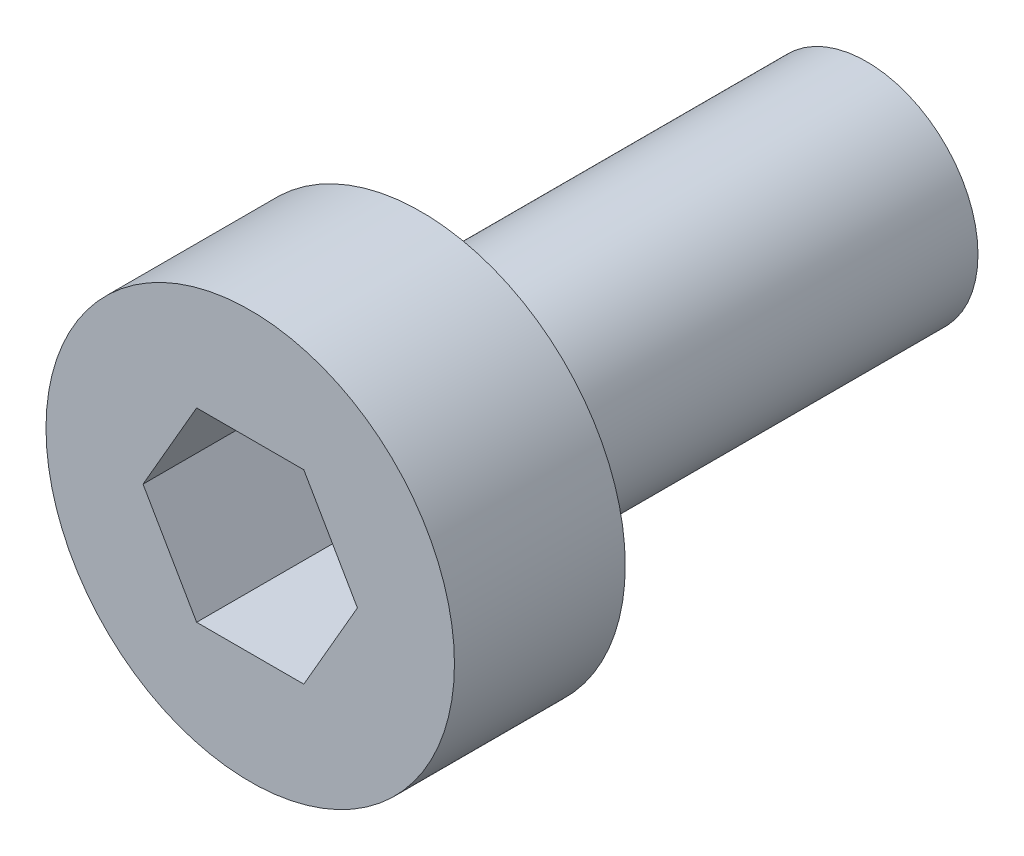
ISO-10303-21;
HEADER;
FILE_DESCRIPTION(('STEP AP214'),'2;1');
FILE_NAME('part.step','',(''),(''),'','','');
FILE_SCHEMA(('AUTOMOTIVE_DESIGN { 1 0 10303 214 1 1 1 1 }'));
ENDSEC;
DATA;
#1=APPLICATION_CONTEXT('core data for automotive mechanical design processes');
#2=APPLICATION_PROTOCOL_DEFINITION('international standard','automotive_design',2000,#1);
#3=PRODUCT_CONTEXT('',#1,'mechanical');
#4=PRODUCT('Part','Part','',(#3));
#5=PRODUCT_RELATED_PRODUCT_CATEGORY('part','',(#4));
#6=PRODUCT_DEFINITION_FORMATION('','',#4);
#7=PRODUCT_DEFINITION_CONTEXT('part definition',#1,'design');
#8=PRODUCT_DEFINITION('design','',#6,#7);
#9=PRODUCT_DEFINITION_SHAPE('','',#8);
#10=(LENGTH_UNIT() NAMED_UNIT(*) SI_UNIT(.MILLI.,.METRE.));
#11=(NAMED_UNIT(*) PLANE_ANGLE_UNIT() SI_UNIT($,.RADIAN.));
#12=(NAMED_UNIT(*) SI_UNIT($,.STERADIAN.) SOLID_ANGLE_UNIT());
#13=UNCERTAINTY_MEASURE_WITH_UNIT(LENGTH_MEASURE(1.E-05),#10,'distance_accuracy_value','');
#14=(GEOMETRIC_REPRESENTATION_CONTEXT(3) GLOBAL_UNCERTAINTY_ASSIGNED_CONTEXT((#13)) GLOBAL_UNIT_ASSIGNED_CONTEXT((#10,
#11,#12)) REPRESENTATION_CONTEXT('',''));
#15=CARTESIAN_POINT('',(0.,0.,0.));
#16=DIRECTION('',(0.,0.,1.));
#17=DIRECTION('',(1.,0.,0.));
#18=AXIS2_PLACEMENT_3D('',#15,#16,#17);
#19=CARTESIAN_POINT('',(0.,0.,6.));
#20=DIRECTION('',(0.,0.,-1.));
#21=DIRECTION('',(-1.,0.,0.));
#22=AXIS2_PLACEMENT_3D('',#19,#20,#21);
#23=CYLINDRICAL_SURFACE('',#22,1.5);
#24=CARTESIAN_POINT('',(0.,0.,6.));
#25=DIRECTION('',(0.,0.,1.));
#26=DIRECTION('',(1.,0.,0.));
#27=AXIS2_PLACEMENT_3D('',#24,#25,#26);
#28=CIRCLE('',#27,1.5);
#29=CARTESIAN_POINT('',(1.5,0.,6.));
#30=VERTEX_POINT('',#29);
#31=EDGE_CURVE('E11',#30,#30,#28,.T.);
#32=ORIENTED_EDGE('',*,*,#31,.F.);
#33=EDGE_LOOP('',(#32));
#34=FACE_BOUND('',#33,.T.);
#35=CARTESIAN_POINT('',(0.,0.,0.));
#36=DIRECTION('',(0.,0.,1.));
#37=DIRECTION('',(1.,0.,0.));
#38=AXIS2_PLACEMENT_3D('',#35,#36,#37);
#39=CIRCLE('',#38,1.5);
#40=CARTESIAN_POINT('',(1.5,0.,0.));
#41=VERTEX_POINT('',#40);
#42=EDGE_CURVE('E42',#41,#41,#39,.T.);
#43=ORIENTED_EDGE('',*,*,#42,.T.);
#44=EDGE_LOOP('',(#43));
#45=FACE_BOUND('',#44,.T.);
#46=ADVANCED_FACE('F39',(#34,#45),#23,.T.);
#47=CARTESIAN_POINT('',(0.,0.,0.));
#48=DIRECTION('',(0.,0.,1.));
#49=DIRECTION('',(1.,0.,0.));
#50=AXIS2_PLACEMENT_3D('',#47,#48,#49);
#51=PLANE('',#50);
#52=ORIENTED_EDGE('',*,*,#42,.F.);
#53=EDGE_LOOP('',(#52));
#54=FACE_BOUND('',#53,.T.);
#55=ADVANCED_FACE('F189',(#54),#51,.F.);
#56=CARTESIAN_POINT('',(0.,0.,8.3));
#57=DIRECTION('',(0.,0.,-1.));
#58=DIRECTION('',(-1.,0.,0.));
#59=AXIS2_PLACEMENT_3D('',#56,#57,#58);
#60=CYLINDRICAL_SURFACE('',#59,2.75);
#61=CARTESIAN_POINT('',(0.,0.,8.3));
#62=DIRECTION('',(0.,0.,1.));
#63=DIRECTION('',(1.,0.,0.));
#64=AXIS2_PLACEMENT_3D('',#61,#62,#63);
#65=CIRCLE('',#64,2.75);
#66=CARTESIAN_POINT('',(2.75,0.,8.3));
#67=VERTEX_POINT('',#66);
#68=EDGE_CURVE('E163',#67,#67,#65,.T.);
#69=ORIENTED_EDGE('',*,*,#68,.F.);
#70=EDGE_LOOP('',(#69));
#71=FACE_BOUND('',#70,.T.);
#72=CARTESIAN_POINT('',(0.,0.,6.));
#73=DIRECTION('',(0.,0.,1.));
#74=DIRECTION('',(1.,0.,0.));
#75=AXIS2_PLACEMENT_3D('',#72,#73,#74);
#76=CIRCLE('',#75,2.75);
#77=CARTESIAN_POINT('',(2.75,0.,6.));
#78=VERTEX_POINT('',#77);
#79=EDGE_CURVE('E153',#78,#78,#76,.T.);
#80=ORIENTED_EDGE('',*,*,#79,.T.);
#81=EDGE_LOOP('',(#80));
#82=FACE_BOUND('',#81,.T.);
#83=ADVANCED_FACE('F171',(#71,#82),#60,.T.);
#84=CARTESIAN_POINT('',(0.,0.,8.3));
#85=DIRECTION('',(0.,0.,1.));
#86=DIRECTION('',(1.,0.,0.));
#87=AXIS2_PLACEMENT_3D('',#84,#85,#86);
#88=PLANE('',#87);
#89=DIRECTION('',(0.5,0.866025403784439,0.));
#90=VECTOR('',#89,1.);
#91=CARTESIAN_POINT('',(0.721687836487032,-1.25,8.3));
#92=LINE('',#91,#90);
#93=CARTESIAN_POINT('',(0.721687836487032,-1.25,8.3));
#94=VERTEX_POINT('',#93);
#95=CARTESIAN_POINT('',(1.44337567297406,0.,8.3));
#96=VERTEX_POINT('',#95);
#97=EDGE_CURVE('E54',#94,#96,#92,.T.);
#98=ORIENTED_EDGE('',*,*,#97,.F.);
#99=DIRECTION('',(1.,0.,0.));
#100=VECTOR('',#99,1.);
#101=CARTESIAN_POINT('',(-0.721687836487033,-1.25,8.3));
#102=LINE('',#101,#100);
#103=CARTESIAN_POINT('',(-0.721687836487033,-1.25,8.3));
#104=VERTEX_POINT('',#103);
#105=EDGE_CURVE('E147',#104,#94,#102,.T.);
#106=ORIENTED_EDGE('',*,*,#105,.F.);
#107=DIRECTION('',(0.5,-0.866025403784439,0.));
#108=VECTOR('',#107,1.);
#109=CARTESIAN_POINT('',(-1.44337567297407,0.,8.3));
#110=LINE('',#109,#108);
#111=CARTESIAN_POINT('',(-1.44337567297407,0.,8.3));
#112=VERTEX_POINT('',#111);
#113=EDGE_CURVE('E144',#112,#104,#110,.T.);
#114=ORIENTED_EDGE('',*,*,#113,.F.);
#115=DIRECTION('',(-0.5,-0.866025403784439,0.));
#116=VECTOR('',#115,1.);
#117=CARTESIAN_POINT('',(-0.721687836487033,1.25,8.3));
#118=LINE('',#117,#116);
#119=CARTESIAN_POINT('',(-0.721687836487033,1.25,8.3));
#120=VERTEX_POINT('',#119);
#121=EDGE_CURVE('E102',#120,#112,#118,.T.);
#122=ORIENTED_EDGE('',*,*,#121,.F.);
#123=DIRECTION('',(-1.,0.,0.));
#124=VECTOR('',#123,1.);
#125=CARTESIAN_POINT('',(0.721687836487032,1.25,8.3));
#126=LINE('',#125,#124);
#127=CARTESIAN_POINT('',(0.721687836487032,1.25,8.3));
#128=VERTEX_POINT('',#127);
#129=EDGE_CURVE('E138',#128,#120,#126,.T.);
#130=ORIENTED_EDGE('',*,*,#129,.F.);
#131=DIRECTION('',(-0.5,0.866025403784439,0.));
#132=VECTOR('',#131,1.);
#133=CARTESIAN_POINT('',(1.44337567297406,0.,8.3));
#134=LINE('',#133,#132);
#135=EDGE_CURVE('E134',#96,#128,#134,.T.);
#136=ORIENTED_EDGE('',*,*,#135,.F.);
#137=EDGE_LOOP('',(#98,#106,#114,#122,#130,#136));
#138=FACE_BOUND('',#137,.T.);
#139=ORIENTED_EDGE('',*,*,#68,.T.);
#140=EDGE_LOOP('',(#139));
#141=FACE_BOUND('',#140,.T.);
#142=ADVANCED_FACE('F176',(#138,#141),#88,.T.);
#143=CARTESIAN_POINT('',(0.,0.,6.));
#144=DIRECTION('',(0.,0.,1.));
#145=DIRECTION('',(1.,0.,0.));
#146=AXIS2_PLACEMENT_3D('',#143,#144,#145);
#147=PLANE('',#146);
#148=ORIENTED_EDGE('',*,*,#31,.T.);
#149=EDGE_LOOP('',(#148));
#150=FACE_BOUND('',#149,.T.);
#151=ORIENTED_EDGE('',*,*,#79,.F.);
#152=EDGE_LOOP('',(#151));
#153=FACE_BOUND('',#152,.T.);
#154=ADVANCED_FACE('F173',(#150,#153),#147,.F.);
#155=CARTESIAN_POINT('',(0.721687836487032,-1.25,6.3));
#156=DIRECTION('',(0.866025403784439,-0.5,0.));
#157=DIRECTION('',(0.5,0.866025403784439,0.));
#158=AXIS2_PLACEMENT_3D('',#155,#156,#157);
#159=PLANE('',#158);
#160=ORIENTED_EDGE('',*,*,#97,.T.);
#161=DIRECTION('',(0.,0.,1.));
#162=VECTOR('',#161,1.);
#163=CARTESIAN_POINT('',(1.44337567297406,0.,6.3));
#164=LINE('',#163,#162);
#165=CARTESIAN_POINT('',(1.44337567297406,0.,6.3));
#166=VERTEX_POINT('',#165);
#167=EDGE_CURVE('E84',#166,#96,#164,.T.);
#168=ORIENTED_EDGE('',*,*,#167,.F.);
#169=DIRECTION('',(0.5,0.866025403784439,0.));
#170=VECTOR('',#169,1.);
#171=CARTESIAN_POINT('',(0.721687836487032,-1.25,6.3));
#172=LINE('',#171,#170);
#173=CARTESIAN_POINT('',(0.721687836487032,-1.25,6.3));
#174=VERTEX_POINT('',#173);
#175=EDGE_CURVE('E150',#174,#166,#172,.T.);
#176=ORIENTED_EDGE('',*,*,#175,.F.);
#177=DIRECTION('',(0.,0.,1.));
#178=VECTOR('',#177,1.);
#179=CARTESIAN_POINT('',(0.721687836487032,-1.25,6.3));
#180=LINE('',#179,#178);
#181=EDGE_CURVE('E62',#174,#94,#180,.T.);
#182=ORIENTED_EDGE('',*,*,#181,.T.);
#183=EDGE_LOOP('',(#160,#168,#176,#182));
#184=FACE_BOUND('',#183,.T.);
#185=ADVANCED_FACE('F175',(#184),#159,.F.);
#186=CARTESIAN_POINT('',(-0.721687836487033,-1.25,6.3));
#187=DIRECTION('',(0.,-1.,0.));
#188=DIRECTION('',(1.,0.,0.));
#189=AXIS2_PLACEMENT_3D('',#186,#187,#188);
#190=PLANE('',#189);
#191=ORIENTED_EDGE('',*,*,#105,.T.);
#192=ORIENTED_EDGE('',*,*,#181,.F.);
#193=DIRECTION('',(1.,0.,0.));
#194=VECTOR('',#193,1.);
#195=CARTESIAN_POINT('',(-0.721687836487033,-1.25,6.3));
#196=LINE('',#195,#194);
#197=CARTESIAN_POINT('',(-0.721687836487033,-1.25,6.3));
#198=VERTEX_POINT('',#197);
#199=EDGE_CURVE('E116',#198,#174,#196,.T.);
#200=ORIENTED_EDGE('',*,*,#199,.F.);
#201=DIRECTION('',(0.,0.,1.));
#202=VECTOR('',#201,1.);
#203=CARTESIAN_POINT('',(-0.721687836487033,-1.25,6.3));
#204=LINE('',#203,#202);
#205=EDGE_CURVE('E107',#198,#104,#204,.T.);
#206=ORIENTED_EDGE('',*,*,#205,.T.);
#207=EDGE_LOOP('',(#191,#192,#200,#206));
#208=FACE_BOUND('',#207,.T.);
#209=ADVANCED_FACE('F183',(#208),#190,.F.);
#210=CARTESIAN_POINT('',(-1.44337567297407,0.,6.3));
#211=DIRECTION('',(-0.866025403784439,-0.5,0.));
#212=DIRECTION('',(0.5,-0.866025403784439,0.));
#213=AXIS2_PLACEMENT_3D('',#210,#211,#212);
#214=PLANE('',#213);
#215=ORIENTED_EDGE('',*,*,#113,.T.);
#216=ORIENTED_EDGE('',*,*,#205,.F.);
#217=DIRECTION('',(0.5,-0.866025403784439,0.));
#218=VECTOR('',#217,1.);
#219=CARTESIAN_POINT('',(-1.44337567297407,0.,6.3));
#220=LINE('',#219,#218);
#221=CARTESIAN_POINT('',(-1.44337567297407,0.,6.3));
#222=VERTEX_POINT('',#221);
#223=EDGE_CURVE('E111',#222,#198,#220,.T.);
#224=ORIENTED_EDGE('',*,*,#223,.F.);
#225=DIRECTION('',(0.,0.,1.));
#226=VECTOR('',#225,1.);
#227=CARTESIAN_POINT('',(-1.44337567297407,0.,6.3));
#228=LINE('',#227,#226);
#229=EDGE_CURVE('E95',#222,#112,#228,.T.);
#230=ORIENTED_EDGE('',*,*,#229,.T.);
#231=EDGE_LOOP('',(#215,#216,#224,#230));
#232=FACE_BOUND('',#231,.T.);
#233=ADVANCED_FACE('F112',(#232),#214,.F.);
#234=CARTESIAN_POINT('',(-0.721687836487033,1.25,6.3));
#235=DIRECTION('',(-0.866025403784439,0.5,0.));
#236=DIRECTION('',(-0.5,-0.866025403784439,0.));
#237=AXIS2_PLACEMENT_3D('',#234,#235,#236);
#238=PLANE('',#237);
#239=ORIENTED_EDGE('',*,*,#121,.T.);
#240=ORIENTED_EDGE('',*,*,#229,.F.);
#241=DIRECTION('',(-0.5,-0.866025403784439,0.));
#242=VECTOR('',#241,1.);
#243=CARTESIAN_POINT('',(-0.721687836487033,1.25,6.3));
#244=LINE('',#243,#242);
#245=CARTESIAN_POINT('',(-0.721687836487033,1.25,6.3));
#246=VERTEX_POINT('',#245);
#247=EDGE_CURVE('E99',#246,#222,#244,.T.);
#248=ORIENTED_EDGE('',*,*,#247,.F.);
#249=DIRECTION('',(0.,0.,1.));
#250=VECTOR('',#249,1.);
#251=CARTESIAN_POINT('',(-0.721687836487033,1.25,6.3));
#252=LINE('',#251,#250);
#253=EDGE_CURVE('E108',#246,#120,#252,.T.);
#254=ORIENTED_EDGE('',*,*,#253,.T.);
#255=EDGE_LOOP('',(#239,#240,#248,#254));
#256=FACE_BOUND('',#255,.T.);
#257=ADVANCED_FACE('F97',(#256),#238,.F.);
#258=CARTESIAN_POINT('',(0.721687836487032,1.25,6.3));
#259=DIRECTION('',(0.,1.,0.));
#260=DIRECTION('',(0.,0.,1.));
#261=AXIS2_PLACEMENT_3D('',#258,#259,#260);
#262=PLANE('',#261);
#263=ORIENTED_EDGE('',*,*,#129,.T.);
#264=ORIENTED_EDGE('',*,*,#253,.F.);
#265=DIRECTION('',(-1.,0.,0.));
#266=VECTOR('',#265,1.);
#267=CARTESIAN_POINT('',(0.721687836487032,1.25,6.3));
#268=LINE('',#267,#266);
#269=CARTESIAN_POINT('',(0.721687836487032,1.25,6.3));
#270=VERTEX_POINT('',#269);
#271=EDGE_CURVE('E122',#270,#246,#268,.T.);
#272=ORIENTED_EDGE('',*,*,#271,.F.);
#273=DIRECTION('',(0.,0.,1.));
#274=VECTOR('',#273,1.);
#275=CARTESIAN_POINT('',(0.721687836487032,1.25,6.3));
#276=LINE('',#275,#274);
#277=EDGE_CURVE('E158',#270,#128,#276,.T.);
#278=ORIENTED_EDGE('',*,*,#277,.T.);
#279=EDGE_LOOP('',(#263,#264,#272,#278));
#280=FACE_BOUND('',#279,.T.);
#281=ADVANCED_FACE('F245',(#280),#262,.F.);
#282=CARTESIAN_POINT('',(1.44337567297406,0.,6.3));
#283=DIRECTION('',(0.866025403784439,0.5,0.));
#284=DIRECTION('',(-0.5,0.866025403784439,0.));
#285=AXIS2_PLACEMENT_3D('',#282,#283,#284);
#286=PLANE('',#285);
#287=ORIENTED_EDGE('',*,*,#135,.T.);
#288=ORIENTED_EDGE('',*,*,#277,.F.);
#289=DIRECTION('',(-0.5,0.866025403784439,0.));
#290=VECTOR('',#289,1.);
#291=CARTESIAN_POINT('',(1.44337567297406,0.,6.3));
#292=LINE('',#291,#290);
#293=EDGE_CURVE('E126',#166,#270,#292,.T.);
#294=ORIENTED_EDGE('',*,*,#293,.F.);
#295=ORIENTED_EDGE('',*,*,#167,.T.);
#296=EDGE_LOOP('',(#287,#288,#294,#295));
#297=FACE_BOUND('',#296,.T.);
#298=ADVANCED_FACE('F254',(#297),#286,.F.);
#299=CARTESIAN_POINT('',(0.,0.,6.3));
#300=DIRECTION('',(0.,0.,1.));
#301=DIRECTION('',(1.,0.,0.));
#302=AXIS2_PLACEMENT_3D('',#299,#300,#301);
#303=PLANE('',#302);
#304=ORIENTED_EDGE('',*,*,#175,.T.);
#305=ORIENTED_EDGE('',*,*,#293,.T.);
#306=ORIENTED_EDGE('',*,*,#271,.T.);
#307=ORIENTED_EDGE('',*,*,#247,.T.);
#308=ORIENTED_EDGE('',*,*,#223,.T.);
#309=ORIENTED_EDGE('',*,*,#199,.T.);
#310=EDGE_LOOP('',(#304,#305,#306,#307,#308,#309));
#311=FACE_BOUND('',#310,.T.);
#312=ADVANCED_FACE('F119',(#311),#303,.T.);
#313=CLOSED_SHELL('',(#46,#55,#83,#142,#154,#185,#209,#233,#257,#281,#298,#312));
#314=MANIFOLD_SOLID_BREP('B2',#313);
#315=ADVANCED_BREP_SHAPE_REPRESENTATION('',(#18,#314),#14);
#316=SHAPE_DEFINITION_REPRESENTATION(#9,#315);
ENDSEC;
END-ISO-10303-21;
